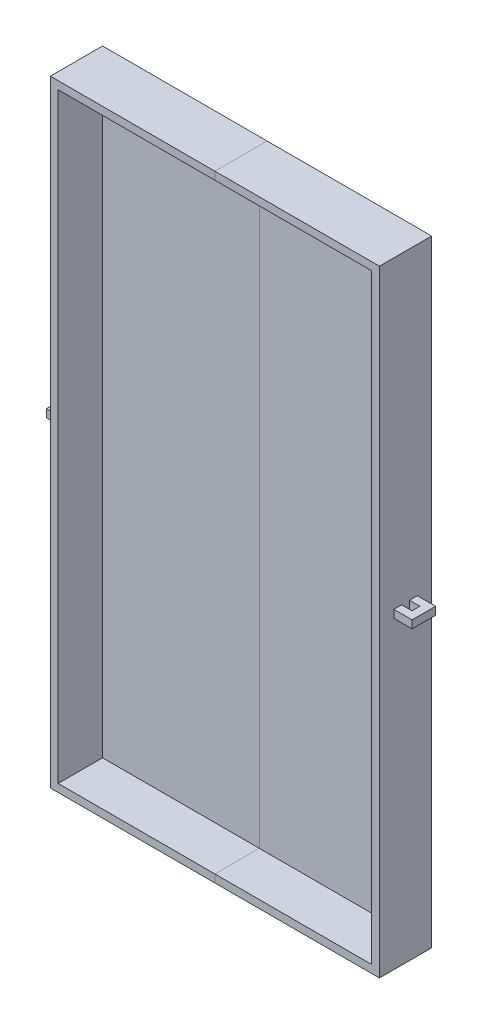
ISO-10303-21;
HEADER;
FILE_DESCRIPTION(('STEP AP214'),'2;1');
FILE_NAME('part.step','',(''),(''),'','','');
FILE_SCHEMA(('AUTOMOTIVE_DESIGN { 1 0 10303 214 1 1 1 1 }'));
ENDSEC;
DATA;
#1=APPLICATION_CONTEXT('core data for automotive mechanical design processes');
#2=APPLICATION_PROTOCOL_DEFINITION('international standard','automotive_design',2000,#1);
#3=PRODUCT_CONTEXT('',#1,'mechanical');
#4=PRODUCT('Part','Part','',(#3));
#5=PRODUCT_RELATED_PRODUCT_CATEGORY('part','',(#4));
#6=PRODUCT_DEFINITION_FORMATION('','',#4);
#7=PRODUCT_DEFINITION_CONTEXT('part definition',#1,'design');
#8=PRODUCT_DEFINITION('design','',#6,#7);
#9=PRODUCT_DEFINITION_SHAPE('','',#8);
#10=(LENGTH_UNIT() NAMED_UNIT(*) SI_UNIT(.MILLI.,.METRE.));
#11=(NAMED_UNIT(*) PLANE_ANGLE_UNIT() SI_UNIT($,.RADIAN.));
#12=(NAMED_UNIT(*) SI_UNIT($,.STERADIAN.) SOLID_ANGLE_UNIT());
#13=UNCERTAINTY_MEASURE_WITH_UNIT(LENGTH_MEASURE(1.E-05),#10,'distance_accuracy_value','');
#14=(GEOMETRIC_REPRESENTATION_CONTEXT(3) GLOBAL_UNCERTAINTY_ASSIGNED_CONTEXT((#13)) GLOBAL_UNIT_ASSIGNED_CONTEXT((#10,
#11,#12)) REPRESENTATION_CONTEXT('',''));
#15=CARTESIAN_POINT('',(0.,0.,0.));
#16=DIRECTION('',(0.,0.,1.));
#17=DIRECTION('',(1.,0.,0.));
#18=AXIS2_PLACEMENT_3D('',#15,#16,#17);
#19=CARTESIAN_POINT('',(63.,59.75,4.25));
#20=DIRECTION('',(0.,1.,0.));
#21=DIRECTION('',(0.,0.,1.));
#22=AXIS2_PLACEMENT_3D('',#19,#20,#21);
#23=PLANE('',#22);
#24=DIRECTION('',(0.,0.,-1.));
#25=VECTOR('',#24,1.);
#26=CARTESIAN_POINT('',(65.,59.75,3.5));
#27=LINE('',#26,#25);
#28=CARTESIAN_POINT('',(65.,59.75,2.75));
#29=VERTEX_POINT('',#28);
#30=CARTESIAN_POINT('',(65.,59.75,4.25));
#31=VERTEX_POINT('',#30);
#32=EDGE_CURVE('P0_E125',#29,#31,#27,.F.);
#33=ORIENTED_EDGE('',*,*,#32,.T.);
#34=DIRECTION('',(-1.,0.,0.));
#35=VECTOR('',#34,1.);
#36=CARTESIAN_POINT('',(63.,59.75,4.25));
#37=LINE('',#36,#35);
#38=CARTESIAN_POINT('',(63.,59.75,4.25));
#39=VERTEX_POINT('',#38);
#40=EDGE_CURVE('P0_E160',#39,#31,#37,.F.);
#41=ORIENTED_EDGE('',*,*,#40,.F.);
#42=DIRECTION('',(0.,0.,1.));
#43=VECTOR('',#42,1.);
#44=CARTESIAN_POINT('',(63.,59.75,4.25));
#45=LINE('',#44,#43);
#46=CARTESIAN_POINT('',(63.,59.75,5.75));
#47=VERTEX_POINT('',#46);
#48=EDGE_CURVE('P0_E19',#39,#47,#45,.T.);
#49=ORIENTED_EDGE('',*,*,#48,.T.);
#50=DIRECTION('',(1.,0.,0.));
#51=VECTOR('',#50,1.);
#52=CARTESIAN_POINT('',(63.,59.75,5.75));
#53=LINE('',#52,#51);
#54=CARTESIAN_POINT('',(66.5,59.75,5.75));
#55=VERTEX_POINT('',#54);
#56=EDGE_CURVE('P0_E191',#55,#47,#53,.F.);
#57=ORIENTED_EDGE('',*,*,#56,.F.);
#58=DIRECTION('',(0.,0.,-1.));
#59=VECTOR('',#58,1.);
#60=CARTESIAN_POINT('',(66.5,59.75,3.5));
#61=LINE('',#60,#59);
#62=CARTESIAN_POINT('',(66.5,59.75,1.25));
#63=VERTEX_POINT('',#62);
#64=EDGE_CURVE('P0_E199',#63,#55,#61,.F.);
#65=ORIENTED_EDGE('',*,*,#64,.F.);
#66=DIRECTION('',(-1.,0.,0.));
#67=VECTOR('',#66,1.);
#68=CARTESIAN_POINT('',(63.,59.75,1.25));
#69=LINE('',#68,#67);
#70=CARTESIAN_POINT('',(63.,59.75,1.25));
#71=VERTEX_POINT('',#70);
#72=EDGE_CURVE('P0_E148',#71,#63,#69,.F.);
#73=ORIENTED_EDGE('',*,*,#72,.F.);
#74=DIRECTION('',(0.,0.,1.));
#75=VECTOR('',#74,1.);
#76=CARTESIAN_POINT('',(63.,59.75,4.25));
#77=LINE('',#76,#75);
#78=CARTESIAN_POINT('',(63.,59.75,2.75));
#79=VERTEX_POINT('',#78);
#80=EDGE_CURVE('P0_E134',#71,#79,#77,.T.);
#81=ORIENTED_EDGE('',*,*,#80,.T.);
#82=DIRECTION('',(1.,0.,0.));
#83=VECTOR('',#82,1.);
#84=CARTESIAN_POINT('',(63.,59.75,2.75));
#85=LINE('',#84,#83);
#86=EDGE_CURVE('P0_E145',#29,#79,#85,.F.);
#87=ORIENTED_EDGE('',*,*,#86,.F.);
#88=EDGE_LOOP('',(#33,#41,#49,#57,#65,#73,#81,#87));
#89=FACE_BOUND('',#88,.T.);
#90=ADVANCED_FACE('P0_F16',(#89),#23,.T.);
#91=CARTESIAN_POINT('',(65.,59.,3.5));
#92=DIRECTION('',(1.,0.,0.));
#93=DIRECTION('',(0.,0.,-1.));
#94=AXIS2_PLACEMENT_3D('',#91,#92,#93);
#95=PLANE('',#94);
#96=ORIENTED_EDGE('',*,*,#32,.F.);
#97=DIRECTION('',(0.,1.,0.));
#98=VECTOR('',#97,1.);
#99=CARTESIAN_POINT('',(65.,59.75,2.75));
#100=LINE('',#99,#98);
#101=CARTESIAN_POINT('',(65.,58.25,2.75));
#102=VERTEX_POINT('',#101);
#103=EDGE_CURVE('P0_E142',#102,#29,#100,.T.);
#104=ORIENTED_EDGE('',*,*,#103,.F.);
#105=DIRECTION('',(0.,0.,-1.));
#106=VECTOR('',#105,1.);
#107=CARTESIAN_POINT('',(65.,58.25,5.75));
#108=LINE('',#107,#106);
#109=CARTESIAN_POINT('',(65.,58.25,4.25));
#110=VERTEX_POINT('',#109);
#111=EDGE_CURVE('P0_E166',#110,#102,#108,.T.);
#112=ORIENTED_EDGE('',*,*,#111,.F.);
#113=DIRECTION('',(0.,1.,0.));
#114=VECTOR('',#113,1.);
#115=CARTESIAN_POINT('',(65.,58.25,4.25));
#116=LINE('',#115,#114);
#117=EDGE_CURVE('P0_E163',#31,#110,#116,.F.);
#118=ORIENTED_EDGE('',*,*,#117,.F.);
#119=EDGE_LOOP('',(#96,#104,#112,#118));
#120=FACE_BOUND('',#119,.T.);
#121=ADVANCED_FACE('P0_F164',(#120),#95,.F.);
#122=CARTESIAN_POINT('',(63.,59.75,2.75));
#123=DIRECTION('',(0.,0.,1.));
#124=DIRECTION('',(1.,0.,0.));
#125=AXIS2_PLACEMENT_3D('',#122,#123,#124);
#126=PLANE('',#125);
#127=ORIENTED_EDGE('',*,*,#103,.T.);
#128=ORIENTED_EDGE('',*,*,#86,.T.);
#129=DIRECTION('',(0.,1.,0.));
#130=VECTOR('',#129,1.);
#131=CARTESIAN_POINT('',(63.,59.75,2.75));
#132=LINE('',#131,#130);
#133=CARTESIAN_POINT('',(63.,58.25,2.75));
#134=VERTEX_POINT('',#133);
#135=EDGE_CURVE('P0_E130',#79,#134,#132,.F.);
#136=ORIENTED_EDGE('',*,*,#135,.T.);
#137=DIRECTION('',(1.,0.,0.));
#138=VECTOR('',#137,1.);
#139=CARTESIAN_POINT('',(63.,58.25,2.75));
#140=LINE('',#139,#138);
#141=EDGE_CURVE('P0_E220',#102,#134,#140,.F.);
#142=ORIENTED_EDGE('',*,*,#141,.F.);
#143=EDGE_LOOP('',(#127,#128,#136,#142));
#144=FACE_BOUND('',#143,.T.);
#145=ADVANCED_FACE('P0_F150',(#144),#126,.T.);
#146=CARTESIAN_POINT('',(63.,58.25,1.25));
#147=DIRECTION('',(0.,0.,-1.));
#148=DIRECTION('',(-1.,0.,0.));
#149=AXIS2_PLACEMENT_3D('',#146,#147,#148);
#150=PLANE('',#149);
#151=DIRECTION('',(0.,1.,0.));
#152=VECTOR('',#151,1.);
#153=CARTESIAN_POINT('',(66.5,59.,1.25));
#154=LINE('',#153,#152);
#155=CARTESIAN_POINT('',(66.5,58.25,1.25));
#156=VERTEX_POINT('',#155);
#157=EDGE_CURVE('P0_E201',#156,#63,#154,.T.);
#158=ORIENTED_EDGE('',*,*,#157,.F.);
#159=DIRECTION('',(1.,0.,0.));
#160=VECTOR('',#159,1.);
#161=CARTESIAN_POINT('',(63.,58.25,1.25));
#162=LINE('',#161,#160);
#163=CARTESIAN_POINT('',(63.,58.25,1.25));
#164=VERTEX_POINT('',#163);
#165=EDGE_CURVE('P0_E217',#164,#156,#162,.T.);
#166=ORIENTED_EDGE('',*,*,#165,.F.);
#167=DIRECTION('',(0.,1.,0.));
#168=VECTOR('',#167,1.);
#169=CARTESIAN_POINT('',(63.,58.25,1.25));
#170=LINE('',#169,#168);
#171=EDGE_CURVE('P0_E151',#164,#71,#170,.T.);
#172=ORIENTED_EDGE('',*,*,#171,.T.);
#173=ORIENTED_EDGE('',*,*,#72,.T.);
#174=EDGE_LOOP('',(#158,#166,#172,#173));
#175=FACE_BOUND('',#174,.T.);
#176=ADVANCED_FACE('P0_F204',(#175),#150,.T.);
#177=CARTESIAN_POINT('',(66.5,59.,3.5));
#178=DIRECTION('',(1.,0.,0.));
#179=DIRECTION('',(0.,0.,-1.));
#180=AXIS2_PLACEMENT_3D('',#177,#178,#179);
#181=PLANE('',#180);
#182=ORIENTED_EDGE('',*,*,#64,.T.);
#183=DIRECTION('',(0.,1.,0.));
#184=VECTOR('',#183,1.);
#185=CARTESIAN_POINT('',(66.5,59.75,5.75));
#186=LINE('',#185,#184);
#187=CARTESIAN_POINT('',(66.5,58.25,5.75));
#188=VERTEX_POINT('',#187);
#189=EDGE_CURVE('P0_E194',#188,#55,#186,.T.);
#190=ORIENTED_EDGE('',*,*,#189,.F.);
#191=DIRECTION('',(0.,0.,-1.));
#192=VECTOR('',#191,1.);
#193=CARTESIAN_POINT('',(66.5,58.25,5.75));
#194=LINE('',#193,#192);
#195=EDGE_CURVE('P0_E211',#156,#188,#194,.F.);
#196=ORIENTED_EDGE('',*,*,#195,.F.);
#197=ORIENTED_EDGE('',*,*,#157,.T.);
#198=EDGE_LOOP('',(#182,#190,#196,#197));
#199=FACE_BOUND('',#198,.T.);
#200=ADVANCED_FACE('P0_F209',(#199),#181,.T.);
#201=CARTESIAN_POINT('',(63.,59.75,5.75));
#202=DIRECTION('',(0.,0.,1.));
#203=DIRECTION('',(1.,0.,0.));
#204=AXIS2_PLACEMENT_3D('',#201,#202,#203);
#205=PLANE('',#204);
#206=ORIENTED_EDGE('',*,*,#189,.T.);
#207=ORIENTED_EDGE('',*,*,#56,.T.);
#208=DIRECTION('',(0.,1.,0.));
#209=VECTOR('',#208,1.);
#210=CARTESIAN_POINT('',(63.,59.75,5.75));
#211=LINE('',#210,#209);
#212=CARTESIAN_POINT('',(63.,58.25,5.75));
#213=VERTEX_POINT('',#212);
#214=EDGE_CURVE('P0_E197',#47,#213,#211,.F.);
#215=ORIENTED_EDGE('',*,*,#214,.T.);
#216=DIRECTION('',(1.,0.,0.));
#217=VECTOR('',#216,1.);
#218=CARTESIAN_POINT('',(63.,58.25,5.75));
#219=LINE('',#218,#217);
#220=EDGE_CURVE('P0_E216',#188,#213,#219,.F.);
#221=ORIENTED_EDGE('',*,*,#220,.F.);
#222=EDGE_LOOP('',(#206,#207,#215,#221));
#223=FACE_BOUND('',#222,.T.);
#224=ADVANCED_FACE('P0_F400',(#223),#205,.T.);
#225=CARTESIAN_POINT('',(61.5,115.5,0.));
#226=DIRECTION('',(1.,0.,0.));
#227=DIRECTION('',(0.,0.,-1.));
#228=AXIS2_PLACEMENT_3D('',#225,#226,#227);
#229=PLANE('',#228);
#230=DIRECTION('',(0.,0.,1.));
#231=VECTOR('',#230,1.);
#232=CARTESIAN_POINT('',(61.5,116.5,0.));
#233=LINE('',#232,#231);
#234=CARTESIAN_POINT('',(61.5,116.5,8.5));
#235=VERTEX_POINT('',#234);
#236=CARTESIAN_POINT('',(61.5,116.5,0.));
#237=VERTEX_POINT('',#236);
#238=EDGE_CURVE('P0_E189',#235,#237,#233,.F.);
#239=ORIENTED_EDGE('',*,*,#238,.T.);
#240=DIRECTION('',(0.,1.,0.));
#241=VECTOR('',#240,1.);
#242=CARTESIAN_POINT('',(61.5,59.,0.));
#243=LINE('',#242,#241);
#244=CARTESIAN_POINT('',(61.5,1.5,0.));
#245=VERTEX_POINT('',#244);
#246=EDGE_CURVE('P0_E186',#245,#237,#243,.T.);
#247=ORIENTED_EDGE('',*,*,#246,.F.);
#248=DIRECTION('',(0.,0.,1.));
#249=VECTOR('',#248,1.);
#250=CARTESIAN_POINT('',(61.5,1.5,0.));
#251=LINE('',#250,#249);
#252=CARTESIAN_POINT('',(61.5,1.5,8.5));
#253=VERTEX_POINT('',#252);
#254=EDGE_CURVE('P0_E177',#253,#245,#251,.F.);
#255=ORIENTED_EDGE('',*,*,#254,.F.);
#256=DIRECTION('',(0.,1.,0.));
#257=VECTOR('',#256,1.);
#258=CARTESIAN_POINT('',(61.5,59.,8.5));
#259=LINE('',#258,#257);
#260=EDGE_CURVE('P0_E259',#253,#235,#259,.T.);
#261=ORIENTED_EDGE('',*,*,#260,.T.);
#262=EDGE_LOOP('',(#239,#247,#255,#261));
#263=FACE_BOUND('',#262,.T.);
#264=ADVANCED_FACE('P0_F274',(#263),#229,.F.);
#265=CARTESIAN_POINT('',(2.5,116.5,0.));
#266=DIRECTION('',(0.,1.,0.));
#267=DIRECTION('',(0.,0.,1.));
#268=AXIS2_PLACEMENT_3D('',#265,#266,#267);
#269=PLANE('',#268);
#270=DIRECTION('',(1.,0.,0.));
#271=VECTOR('',#270,1.);
#272=CARTESIAN_POINT('',(31.5,116.5,0.));
#273=LINE('',#272,#271);
#274=CARTESIAN_POINT('',(31.5,116.5,0.));
#275=VERTEX_POINT('',#274);
#276=EDGE_CURVE('P0_E183',#237,#275,#273,.F.);
#277=ORIENTED_EDGE('',*,*,#276,.F.);
#278=ORIENTED_EDGE('',*,*,#238,.F.);
#279=DIRECTION('',(-1.,0.,0.));
#280=VECTOR('',#279,1.);
#281=CARTESIAN_POINT('',(31.5,116.5,8.5));
#282=LINE('',#281,#280);
#283=CARTESIAN_POINT('',(31.5,116.5,8.5));
#284=VERTEX_POINT('',#283);
#285=EDGE_CURVE('P0_E257',#235,#284,#282,.T.);
#286=ORIENTED_EDGE('',*,*,#285,.T.);
#287=DIRECTION('',(0.,0.,-1.));
#288=VECTOR('',#287,1.);
#289=CARTESIAN_POINT('',(31.5,116.5,0.));
#290=LINE('',#289,#288);
#291=EDGE_CURVE('P0_E250',#284,#275,#290,.T.);
#292=ORIENTED_EDGE('',*,*,#291,.T.);
#293=EDGE_LOOP('',(#277,#278,#286,#292));
#294=FACE_BOUND('',#293,.T.);
#295=ADVANCED_FACE('P0_F277',(#294),#269,.F.);
#296=CARTESIAN_POINT('',(31.5,59.,0.));
#297=DIRECTION('',(0.,0.,1.));
#298=DIRECTION('',(1.,0.,0.));
#299=AXIS2_PLACEMENT_3D('',#296,#297,#298);
#300=PLANE('',#299);
#301=ORIENTED_EDGE('',*,*,#246,.T.);
#302=ORIENTED_EDGE('',*,*,#276,.T.);
#303=DIRECTION('',(0.,1.,0.));
#304=VECTOR('',#303,1.);
#305=CARTESIAN_POINT('',(31.5,0.,0.));
#306=LINE('',#305,#304);
#307=CARTESIAN_POINT('',(31.5,1.5,0.));
#308=VERTEX_POINT('',#307);
#309=EDGE_CURVE('P0_E248',#275,#308,#306,.F.);
#310=ORIENTED_EDGE('',*,*,#309,.T.);
#311=DIRECTION('',(1.,0.,0.));
#312=VECTOR('',#311,1.);
#313=CARTESIAN_POINT('',(60.5,1.5,0.));
#314=LINE('',#313,#312);
#315=EDGE_CURVE('P0_E174',#245,#308,#314,.F.);
#316=ORIENTED_EDGE('',*,*,#315,.F.);
#317=EDGE_LOOP('',(#301,#302,#310,#316));
#318=FACE_BOUND('',#317,.T.);
#319=ADVANCED_FACE('P0_F282',(#318),#300,.T.);
#320=CARTESIAN_POINT('',(60.5,1.5,0.));
#321=DIRECTION('',(0.,1.,0.));
#322=DIRECTION('',(0.,0.,1.));
#323=AXIS2_PLACEMENT_3D('',#320,#321,#322);
#324=PLANE('',#323);
#325=ORIENTED_EDGE('',*,*,#254,.T.);
#326=ORIENTED_EDGE('',*,*,#315,.T.);
#327=DIRECTION('',(0.,0.,-1.));
#328=VECTOR('',#327,1.);
#329=CARTESIAN_POINT('',(31.5,1.5,0.));
#330=LINE('',#329,#328);
#331=CARTESIAN_POINT('',(31.5,1.5,8.5));
#332=VERTEX_POINT('',#331);
#333=EDGE_CURVE('P0_E245',#308,#332,#330,.F.);
#334=ORIENTED_EDGE('',*,*,#333,.T.);
#335=DIRECTION('',(-1.,0.,0.));
#336=VECTOR('',#335,1.);
#337=CARTESIAN_POINT('',(31.5,1.5,8.5));
#338=LINE('',#337,#336);
#339=EDGE_CURVE('P0_E261',#332,#253,#338,.F.);
#340=ORIENTED_EDGE('',*,*,#339,.T.);
#341=EDGE_LOOP('',(#325,#326,#334,#340));
#342=FACE_BOUND('',#341,.T.);
#343=ADVANCED_FACE('P0_F265',(#342),#324,.T.);
#344=CARTESIAN_POINT('',(63.,58.25,4.25));
#345=DIRECTION('',(0.,0.,-1.));
#346=DIRECTION('',(-1.,0.,0.));
#347=AXIS2_PLACEMENT_3D('',#344,#345,#346);
#348=PLANE('',#347);
#349=ORIENTED_EDGE('',*,*,#117,.T.);
#350=DIRECTION('',(1.,0.,0.));
#351=VECTOR('',#350,1.);
#352=CARTESIAN_POINT('',(63.,58.25,4.25));
#353=LINE('',#352,#351);
#354=CARTESIAN_POINT('',(63.,58.25,4.25));
#355=VERTEX_POINT('',#354);
#356=EDGE_CURVE('P0_E169',#355,#110,#353,.T.);
#357=ORIENTED_EDGE('',*,*,#356,.F.);
#358=DIRECTION('',(0.,1.,0.));
#359=VECTOR('',#358,1.);
#360=CARTESIAN_POINT('',(63.,118.,4.25));
#361=LINE('',#360,#359);
#362=EDGE_CURVE('P0_E173',#39,#355,#361,.F.);
#363=ORIENTED_EDGE('',*,*,#362,.F.);
#364=ORIENTED_EDGE('',*,*,#40,.T.);
#365=EDGE_LOOP('',(#349,#357,#363,#364));
#366=FACE_BOUND('',#365,.T.);
#367=ADVANCED_FACE('P0_F171',(#366),#348,.T.);
#368=CARTESIAN_POINT('',(63.,58.25,5.75));
#369=DIRECTION('',(0.,-1.,0.));
#370=DIRECTION('',(0.,0.,-1.));
#371=AXIS2_PLACEMENT_3D('',#368,#369,#370);
#372=PLANE('',#371);
#373=ORIENTED_EDGE('',*,*,#195,.T.);
#374=ORIENTED_EDGE('',*,*,#220,.T.);
#375=DIRECTION('',(0.,0.,-1.));
#376=VECTOR('',#375,1.);
#377=CARTESIAN_POINT('',(63.,58.25,0.));
#378=LINE('',#377,#376);
#379=EDGE_CURVE('P0_E227',#355,#213,#378,.F.);
#380=ORIENTED_EDGE('',*,*,#379,.F.);
#381=ORIENTED_EDGE('',*,*,#356,.T.);
#382=ORIENTED_EDGE('',*,*,#111,.T.);
#383=ORIENTED_EDGE('',*,*,#141,.T.);
#384=DIRECTION('',(0.,0.,-1.));
#385=VECTOR('',#384,1.);
#386=CARTESIAN_POINT('',(63.,58.25,0.));
#387=LINE('',#386,#385);
#388=EDGE_CURVE('P0_E137',#164,#134,#387,.F.);
#389=ORIENTED_EDGE('',*,*,#388,.F.);
#390=ORIENTED_EDGE('',*,*,#165,.T.);
#391=EDGE_LOOP('',(#373,#374,#380,#381,#382,#383,#389,#390));
#392=FACE_BOUND('',#391,.T.);
#393=ADVANCED_FACE('P0_F219',(#392),#372,.T.);
#394=CARTESIAN_POINT('',(31.5,59.,8.5));
#395=DIRECTION('',(0.,0.,-1.));
#396=DIRECTION('',(-1.,0.,0.));
#397=AXIS2_PLACEMENT_3D('',#394,#395,#396);
#398=PLANE('',#397);
#399=DIRECTION('',(1.,0.,0.));
#400=VECTOR('',#399,1.);
#401=CARTESIAN_POINT('',(63.,0.,8.5));
#402=LINE('',#401,#400);
#403=CARTESIAN_POINT('',(63.,0.,8.5));
#404=VERTEX_POINT('',#403);
#405=CARTESIAN_POINT('',(31.5,0.,8.5));
#406=VERTEX_POINT('',#405);
#407=EDGE_CURVE('P0_E288',#404,#406,#402,.F.);
#408=ORIENTED_EDGE('',*,*,#407,.F.);
#409=DIRECTION('',(0.,1.,0.));
#410=VECTOR('',#409,1.);
#411=CARTESIAN_POINT('',(63.,118.,8.5));
#412=LINE('',#411,#410);
#413=CARTESIAN_POINT('',(63.,118.,8.5));
#414=VERTEX_POINT('',#413);
#415=EDGE_CURVE('P0_E237',#414,#404,#412,.F.);
#416=ORIENTED_EDGE('',*,*,#415,.F.);
#417=DIRECTION('',(1.,0.,0.));
#418=VECTOR('',#417,1.);
#419=CARTESIAN_POINT('',(0.,118.,8.5));
#420=LINE('',#419,#418);
#421=CARTESIAN_POINT('',(31.5,118.,8.5));
#422=VERTEX_POINT('',#421);
#423=EDGE_CURVE('P0_E239',#422,#414,#420,.T.);
#424=ORIENTED_EDGE('',*,*,#423,.F.);
#425=DIRECTION('',(0.,1.,0.));
#426=VECTOR('',#425,1.);
#427=CARTESIAN_POINT('',(31.5,0.,8.5));
#428=LINE('',#427,#426);
#429=EDGE_CURVE('P0_E252',#422,#284,#428,.F.);
#430=ORIENTED_EDGE('',*,*,#429,.T.);
#431=ORIENTED_EDGE('',*,*,#285,.F.);
#432=ORIENTED_EDGE('',*,*,#260,.F.);
#433=ORIENTED_EDGE('',*,*,#339,.F.);
#434=DIRECTION('',(0.,1.,0.));
#435=VECTOR('',#434,1.);
#436=CARTESIAN_POINT('',(31.5,0.,8.5));
#437=LINE('',#436,#435);
#438=EDGE_CURVE('P0_E255',#332,#406,#437,.F.);
#439=ORIENTED_EDGE('',*,*,#438,.T.);
#440=EDGE_LOOP('',(#408,#416,#424,#430,#431,#432,#433,#439));
#441=FACE_BOUND('',#440,.T.);
#442=ADVANCED_FACE('P0_F271',(#441),#398,.F.);
#443=CARTESIAN_POINT('',(31.5,0.,0.));
#444=DIRECTION('',(1.,0.,0.));
#445=DIRECTION('',(0.,0.,-1.));
#446=AXIS2_PLACEMENT_3D('',#443,#444,#445);
#447=PLANE('',#446);
#448=ORIENTED_EDGE('',*,*,#309,.F.);
#449=ORIENTED_EDGE('',*,*,#291,.F.);
#450=ORIENTED_EDGE('',*,*,#429,.F.);
#451=DIRECTION('',(0.,0.,1.));
#452=VECTOR('',#451,1.);
#453=CARTESIAN_POINT('',(31.5,118.,0.));
#454=LINE('',#453,#452);
#455=CARTESIAN_POINT('',(31.5,118.,-1.5));
#456=VERTEX_POINT('',#455);
#457=EDGE_CURVE('P0_E242',#456,#422,#454,.T.);
#458=ORIENTED_EDGE('',*,*,#457,.F.);
#459=DIRECTION('',(0.,1.,0.));
#460=VECTOR('',#459,1.);
#461=CARTESIAN_POINT('',(31.5,59.,-1.5));
#462=LINE('',#461,#460);
#463=CARTESIAN_POINT('',(31.5,0.,-1.5));
#464=VERTEX_POINT('',#463);
#465=EDGE_CURVE('P0_E291',#464,#456,#462,.T.);
#466=ORIENTED_EDGE('',*,*,#465,.F.);
#467=DIRECTION('',(0.,0.,-1.));
#468=VECTOR('',#467,1.);
#469=CARTESIAN_POINT('',(31.5,0.,0.));
#470=LINE('',#469,#468);
#471=EDGE_CURVE('P0_E231',#406,#464,#470,.T.);
#472=ORIENTED_EDGE('',*,*,#471,.F.);
#473=ORIENTED_EDGE('',*,*,#438,.F.);
#474=ORIENTED_EDGE('',*,*,#333,.F.);
#475=EDGE_LOOP('',(#448,#449,#450,#458,#466,#472,#473,#474));
#476=FACE_BOUND('',#475,.T.);
#477=ADVANCED_FACE('P0_F284',(#476),#447,.F.);
#478=CARTESIAN_POINT('',(0.,118.,0.));
#479=DIRECTION('',(0.,1.,0.));
#480=DIRECTION('',(0.,0.,1.));
#481=AXIS2_PLACEMENT_3D('',#478,#479,#480);
#482=PLANE('',#481);
#483=DIRECTION('',(0.,0.,-1.));
#484=VECTOR('',#483,1.);
#485=CARTESIAN_POINT('',(63.,118.,0.));
#486=LINE('',#485,#484);
#487=CARTESIAN_POINT('',(63.,118.,-1.5));
#488=VERTEX_POINT('',#487);
#489=EDGE_CURVE('P0_E228',#488,#414,#486,.F.);
#490=ORIENTED_EDGE('',*,*,#489,.F.);
#491=DIRECTION('',(-1.,0.,0.));
#492=VECTOR('',#491,1.);
#493=CARTESIAN_POINT('',(31.5,118.,-1.5));
#494=LINE('',#493,#492);
#495=EDGE_CURVE('P0_E299',#456,#488,#494,.F.);
#496=ORIENTED_EDGE('',*,*,#495,.F.);
#497=ORIENTED_EDGE('',*,*,#457,.T.);
#498=ORIENTED_EDGE('',*,*,#423,.T.);
#499=EDGE_LOOP('',(#490,#496,#497,#498));
#500=FACE_BOUND('',#499,.T.);
#501=ADVANCED_FACE('P0_F306',(#500),#482,.T.);
#502=CARTESIAN_POINT('',(63.,118.,0.));
#503=DIRECTION('',(1.,0.,0.));
#504=DIRECTION('',(0.,0.,-1.));
#505=AXIS2_PLACEMENT_3D('',#502,#503,#504);
#506=PLANE('',#505);
#507=ORIENTED_EDGE('',*,*,#171,.F.);
#508=ORIENTED_EDGE('',*,*,#388,.T.);
#509=ORIENTED_EDGE('',*,*,#135,.F.);
#510=ORIENTED_EDGE('',*,*,#80,.F.);
#511=EDGE_LOOP('',(#507,#508,#509,#510));
#512=FACE_BOUND('',#511,.T.);
#513=ORIENTED_EDGE('',*,*,#48,.F.);
#514=ORIENTED_EDGE('',*,*,#362,.T.);
#515=ORIENTED_EDGE('',*,*,#379,.T.);
#516=ORIENTED_EDGE('',*,*,#214,.F.);
#517=EDGE_LOOP('',(#513,#514,#515,#516));
#518=FACE_BOUND('',#517,.T.);
#519=DIRECTION('',(0.,1.,0.));
#520=VECTOR('',#519,1.);
#521=CARTESIAN_POINT('',(63.,59.,-1.5));
#522=LINE('',#521,#520);
#523=CARTESIAN_POINT('',(63.,0.,-1.5));
#524=VERTEX_POINT('',#523);
#525=EDGE_CURVE('P0_E25',#488,#524,#522,.F.);
#526=ORIENTED_EDGE('',*,*,#525,.F.);
#527=ORIENTED_EDGE('',*,*,#489,.T.);
#528=ORIENTED_EDGE('',*,*,#415,.T.);
#529=DIRECTION('',(0.,0.,-1.));
#530=VECTOR('',#529,1.);
#531=CARTESIAN_POINT('',(63.,0.,0.));
#532=LINE('',#531,#530);
#533=EDGE_CURVE('P0_E34',#524,#404,#532,.F.);
#534=ORIENTED_EDGE('',*,*,#533,.F.);
#535=EDGE_LOOP('',(#526,#527,#528,#534));
#536=FACE_BOUND('',#535,.T.);
#537=ADVANCED_FACE('P0_F132',(#512,#518,#536),#506,.T.);
#538=CARTESIAN_POINT('',(63.,0.,0.));
#539=DIRECTION('',(0.,-1.,0.));
#540=DIRECTION('',(0.,0.,-1.));
#541=AXIS2_PLACEMENT_3D('',#538,#539,#540);
#542=PLANE('',#541);
#543=ORIENTED_EDGE('',*,*,#533,.T.);
#544=ORIENTED_EDGE('',*,*,#407,.T.);
#545=ORIENTED_EDGE('',*,*,#471,.T.);
#546=DIRECTION('',(-1.,0.,0.));
#547=VECTOR('',#546,1.);
#548=CARTESIAN_POINT('',(31.5,0.,-1.5));
#549=LINE('',#548,#547);
#550=EDGE_CURVE('P0_E10',#524,#464,#549,.T.);
#551=ORIENTED_EDGE('',*,*,#550,.F.);
#552=EDGE_LOOP('',(#543,#544,#545,#551));
#553=FACE_BOUND('',#552,.T.);
#554=ADVANCED_FACE('P0_F293',(#553),#542,.T.);
#555=CARTESIAN_POINT('',(31.5,59.,-1.5));
#556=DIRECTION('',(0.,0.,-1.));
#557=DIRECTION('',(-1.,0.,0.));
#558=AXIS2_PLACEMENT_3D('',#555,#556,#557);
#559=PLANE('',#558);
#560=ORIENTED_EDGE('',*,*,#525,.T.);
#561=ORIENTED_EDGE('',*,*,#550,.T.);
#562=ORIENTED_EDGE('',*,*,#465,.T.);
#563=ORIENTED_EDGE('',*,*,#495,.T.);
#564=EDGE_LOOP('',(#560,#561,#562,#563));
#565=FACE_BOUND('',#564,.T.);
#566=ADVANCED_FACE('P0_F303',(#565),#559,.T.);
#567=CLOSED_SHELL('',(#90,#121,#145,#176,#200,#224,#264,#295,#319,#343,#367,#393,#442,#477,#501,
#537,#554,#566));
#568=MANIFOLD_SOLID_BREP('P0_B1',#567);
#569=CARTESIAN_POINT('',(0.,58.25,4.25));
#570=DIRECTION('',(0.,0.,1.));
#571=DIRECTION('',(1.,0.,0.));
#572=AXIS2_PLACEMENT_3D('',#569,#570,#571);
#573=PLANE('',#572);
#574=DIRECTION('',(1.,0.,0.));
#575=VECTOR('',#574,1.);
#576=CARTESIAN_POINT('',(0.,58.25,4.25));
#577=LINE('',#576,#575);
#578=CARTESIAN_POINT('',(0.,58.25,4.25));
#579=VERTEX_POINT('',#578);
#580=CARTESIAN_POINT('',(-2.,58.25,4.25));
#581=VERTEX_POINT('',#580);
#582=EDGE_CURVE('P1_E175',#579,#581,#577,.F.);
#583=ORIENTED_EDGE('',*,*,#582,.T.);
#584=DIRECTION('',(0.,1.,0.));
#585=VECTOR('',#584,1.);
#586=CARTESIAN_POINT('',(-2.,59.,4.25));
#587=LINE('',#586,#585);
#588=CARTESIAN_POINT('',(-2.,59.75,4.25));
#589=VERTEX_POINT('',#588);
#590=EDGE_CURVE('P1_E153',#589,#581,#587,.F.);
#591=ORIENTED_EDGE('',*,*,#590,.F.);
#592=DIRECTION('',(1.,0.,0.));
#593=VECTOR('',#592,1.);
#594=CARTESIAN_POINT('',(0.,59.75,4.25));
#595=LINE('',#594,#593);
#596=CARTESIAN_POINT('',(0.,59.75,4.25));
#597=VERTEX_POINT('',#596);
#598=EDGE_CURVE('P1_E173',#589,#597,#595,.T.);
#599=ORIENTED_EDGE('',*,*,#598,.T.);
#600=DIRECTION('',(0.,1.,0.));
#601=VECTOR('',#600,1.);
#602=CARTESIAN_POINT('',(0.,58.25,4.25));
#603=LINE('',#602,#601);
#604=EDGE_CURVE('P1_E20',#579,#597,#603,.T.);
#605=ORIENTED_EDGE('',*,*,#604,.F.);
#606=EDGE_LOOP('',(#583,#591,#599,#605));
#607=FACE_BOUND('',#606,.T.);
#608=ADVANCED_FACE('P1_F17',(#607),#573,.F.);
#609=CARTESIAN_POINT('',(0.,58.25,1.25));
#610=DIRECTION('',(0.,0.,1.));
#611=DIRECTION('',(1.,0.,0.));
#612=AXIS2_PLACEMENT_3D('',#609,#610,#611);
#613=PLANE('',#612);
#614=DIRECTION('',(1.,0.,0.));
#615=VECTOR('',#614,1.);
#616=CARTESIAN_POINT('',(0.,58.25,1.25));
#617=LINE('',#616,#615);
#618=CARTESIAN_POINT('',(0.,58.25,1.25));
#619=VERTEX_POINT('',#618);
#620=CARTESIAN_POINT('',(-3.50000000000001,58.25,1.25));
#621=VERTEX_POINT('',#620);
#622=EDGE_CURVE('P1_E187',#619,#621,#617,.F.);
#623=ORIENTED_EDGE('',*,*,#622,.T.);
#624=DIRECTION('',(0.,1.,0.));
#625=VECTOR('',#624,1.);
#626=CARTESIAN_POINT('',(-3.50000000000001,59.,1.25));
#627=LINE('',#626,#625);
#628=CARTESIAN_POINT('',(-3.50000000000001,59.75,1.25));
#629=VERTEX_POINT('',#628);
#630=EDGE_CURVE('P1_E139',#621,#629,#627,.T.);
#631=ORIENTED_EDGE('',*,*,#630,.T.);
#632=DIRECTION('',(1.,0.,0.));
#633=VECTOR('',#632,1.);
#634=CARTESIAN_POINT('',(0.,59.75,1.25));
#635=LINE('',#634,#633);
#636=CARTESIAN_POINT('',(0.,59.75,1.25));
#637=VERTEX_POINT('',#636);
#638=EDGE_CURVE('P1_E150',#629,#637,#635,.T.);
#639=ORIENTED_EDGE('',*,*,#638,.T.);
#640=DIRECTION('',(0.,1.,0.));
#641=VECTOR('',#640,1.);
#642=CARTESIAN_POINT('',(0.,58.25,1.25));
#643=LINE('',#642,#641);
#644=EDGE_CURVE('P1_E159',#619,#637,#643,.T.);
#645=ORIENTED_EDGE('',*,*,#644,.F.);
#646=EDGE_LOOP('',(#623,#631,#639,#645));
#647=FACE_BOUND('',#646,.T.);
#648=ADVANCED_FACE('P1_F185',(#647),#613,.F.);
#649=CARTESIAN_POINT('',(-3.50000000000001,59.,3.5));
#650=DIRECTION('',(1.,0.,0.));
#651=DIRECTION('',(0.,0.,-1.));
#652=AXIS2_PLACEMENT_3D('',#649,#650,#651);
#653=PLANE('',#652);
#654=DIRECTION('',(0.,1.,0.));
#655=VECTOR('',#654,1.);
#656=CARTESIAN_POINT('',(-3.50000000000001,59.75,5.75));
#657=LINE('',#656,#655);
#658=CARTESIAN_POINT('',(-3.50000000000001,58.25,5.75));
#659=VERTEX_POINT('',#658);
#660=CARTESIAN_POINT('',(-3.50000000000001,59.75,5.75));
#661=VERTEX_POINT('',#660);
#662=EDGE_CURVE('P1_E132',#659,#661,#657,.T.);
#663=ORIENTED_EDGE('',*,*,#662,.T.);
#664=DIRECTION('',(0.,0.,-1.));
#665=VECTOR('',#664,1.);
#666=CARTESIAN_POINT('',(-3.50000000000001,59.75,4.25));
#667=LINE('',#666,#665);
#668=EDGE_CURVE('P1_E135',#661,#629,#667,.T.);
#669=ORIENTED_EDGE('',*,*,#668,.T.);
#670=ORIENTED_EDGE('',*,*,#630,.F.);
#671=DIRECTION('',(0.,0.,1.));
#672=VECTOR('',#671,1.);
#673=CARTESIAN_POINT('',(-3.50000000000001,58.25,5.75));
#674=LINE('',#673,#672);
#675=EDGE_CURVE('P1_E137',#621,#659,#674,.T.);
#676=ORIENTED_EDGE('',*,*,#675,.T.);
#677=EDGE_LOOP('',(#663,#669,#670,#676));
#678=FACE_BOUND('',#677,.T.);
#679=ADVANCED_FACE('P1_F134',(#678),#653,.F.);
#680=CARTESIAN_POINT('',(0.,59.75,5.75));
#681=DIRECTION('',(0.,0.,-1.));
#682=DIRECTION('',(-1.,0.,0.));
#683=AXIS2_PLACEMENT_3D('',#680,#681,#682);
#684=PLANE('',#683);
#685=DIRECTION('',(1.,0.,0.));
#686=VECTOR('',#685,1.);
#687=CARTESIAN_POINT('',(0.,59.75,5.75));
#688=LINE('',#687,#686);
#689=CARTESIAN_POINT('',(0.,59.75,5.75));
#690=VERTEX_POINT('',#689);
#691=EDGE_CURVE('P1_E146',#690,#661,#688,.F.);
#692=ORIENTED_EDGE('',*,*,#691,.T.);
#693=ORIENTED_EDGE('',*,*,#662,.F.);
#694=DIRECTION('',(1.,0.,0.));
#695=VECTOR('',#694,1.);
#696=CARTESIAN_POINT('',(0.,58.25,5.75));
#697=LINE('',#696,#695);
#698=CARTESIAN_POINT('',(0.,58.25,5.75));
#699=VERTEX_POINT('',#698);
#700=EDGE_CURVE('P1_E190',#659,#699,#697,.T.);
#701=ORIENTED_EDGE('',*,*,#700,.T.);
#702=DIRECTION('',(0.,1.,0.));
#703=VECTOR('',#702,1.);
#704=CARTESIAN_POINT('',(0.,59.75,5.75));
#705=LINE('',#704,#703);
#706=EDGE_CURVE('P1_E126',#690,#699,#705,.F.);
#707=ORIENTED_EDGE('',*,*,#706,.F.);
#708=EDGE_LOOP('',(#692,#693,#701,#707));
#709=FACE_BOUND('',#708,.T.);
#710=ADVANCED_FACE('P1_F152',(#709),#684,.F.);
#711=CARTESIAN_POINT('',(-2.,59.,3.5));
#712=DIRECTION('',(1.,0.,0.));
#713=DIRECTION('',(0.,0.,-1.));
#714=AXIS2_PLACEMENT_3D('',#711,#712,#713);
#715=PLANE('',#714);
#716=DIRECTION('',(0.,1.,0.));
#717=VECTOR('',#716,1.);
#718=CARTESIAN_POINT('',(-2.,59.75,2.75));
#719=LINE('',#718,#717);
#720=CARTESIAN_POINT('',(-2.,58.25,2.75));
#721=VERTEX_POINT('',#720);
#722=CARTESIAN_POINT('',(-2.,59.75,2.75));
#723=VERTEX_POINT('',#722);
#724=EDGE_CURVE('P1_E207',#721,#723,#719,.T.);
#725=ORIENTED_EDGE('',*,*,#724,.T.);
#726=DIRECTION('',(0.,0.,-1.));
#727=VECTOR('',#726,1.);
#728=CARTESIAN_POINT('',(-2.,59.75,4.25));
#729=LINE('',#728,#727);
#730=EDGE_CURVE('P1_E177',#723,#589,#729,.F.);
#731=ORIENTED_EDGE('',*,*,#730,.T.);
#732=ORIENTED_EDGE('',*,*,#590,.T.);
#733=DIRECTION('',(0.,0.,1.));
#734=VECTOR('',#733,1.);
#735=CARTESIAN_POINT('',(-2.,58.25,5.75));
#736=LINE('',#735,#734);
#737=EDGE_CURVE('P1_E199',#581,#721,#736,.F.);
#738=ORIENTED_EDGE('',*,*,#737,.T.);
#739=EDGE_LOOP('',(#725,#731,#732,#738));
#740=FACE_BOUND('',#739,.T.);
#741=ADVANCED_FACE('P1_F206',(#740),#715,.T.);
#742=CARTESIAN_POINT('',(0.,59.75,4.25));
#743=DIRECTION('',(0.,-1.,0.));
#744=DIRECTION('',(0.,0.,-1.));
#745=AXIS2_PLACEMENT_3D('',#742,#743,#744);
#746=PLANE('',#745);
#747=ORIENTED_EDGE('',*,*,#598,.F.);
#748=ORIENTED_EDGE('',*,*,#730,.F.);
#749=DIRECTION('',(-1.,0.,0.));
#750=VECTOR('',#749,1.);
#751=CARTESIAN_POINT('',(0.,59.75,2.75));
#752=LINE('',#751,#750);
#753=CARTESIAN_POINT('',(0.,59.75,2.75));
#754=VERTEX_POINT('',#753);
#755=EDGE_CURVE('P1_E214',#723,#754,#752,.F.);
#756=ORIENTED_EDGE('',*,*,#755,.T.);
#757=DIRECTION('',(0.,0.,-1.));
#758=VECTOR('',#757,1.);
#759=CARTESIAN_POINT('',(0.,59.75,4.25));
#760=LINE('',#759,#758);
#761=EDGE_CURVE('P1_E179',#637,#754,#760,.F.);
#762=ORIENTED_EDGE('',*,*,#761,.F.);
#763=ORIENTED_EDGE('',*,*,#638,.F.);
#764=ORIENTED_EDGE('',*,*,#668,.F.);
#765=ORIENTED_EDGE('',*,*,#691,.F.);
#766=DIRECTION('',(0.,0.,-1.));
#767=VECTOR('',#766,1.);
#768=CARTESIAN_POINT('',(0.,59.75,4.25));
#769=LINE('',#768,#767);
#770=EDGE_CURVE('P1_E166',#597,#690,#769,.F.);
#771=ORIENTED_EDGE('',*,*,#770,.F.);
#772=EDGE_LOOP('',(#747,#748,#756,#762,#763,#764,#765,#771));
#773=FACE_BOUND('',#772,.T.);
#774=ADVANCED_FACE('P1_F144',(#773),#746,.F.);
#775=CARTESIAN_POINT('',(1.5,115.5,0.));
#776=DIRECTION('',(1.,0.,0.));
#777=DIRECTION('',(0.,0.,-1.));
#778=AXIS2_PLACEMENT_3D('',#775,#776,#777);
#779=PLANE('',#778);
#780=DIRECTION('',(0.,1.,0.));
#781=VECTOR('',#780,1.);
#782=CARTESIAN_POINT('',(1.5,59.,0.));
#783=LINE('',#782,#781);
#784=CARTESIAN_POINT('',(1.5,1.5,0.));
#785=VERTEX_POINT('',#784);
#786=CARTESIAN_POINT('',(1.5,116.5,0.));
#787=VERTEX_POINT('',#786);
#788=EDGE_CURVE('P1_E237',#785,#787,#783,.T.);
#789=ORIENTED_EDGE('',*,*,#788,.T.);
#790=DIRECTION('',(0.,0.,-1.));
#791=VECTOR('',#790,1.);
#792=CARTESIAN_POINT('',(1.5,116.5,0.));
#793=LINE('',#792,#791);
#794=CARTESIAN_POINT('',(1.5,116.5,8.5));
#795=VERTEX_POINT('',#794);
#796=EDGE_CURVE('P1_E232',#795,#787,#793,.T.);
#797=ORIENTED_EDGE('',*,*,#796,.F.);
#798=DIRECTION('',(0.,1.,0.));
#799=VECTOR('',#798,1.);
#800=CARTESIAN_POINT('',(1.5,59.,8.5));
#801=LINE('',#800,#799);
#802=CARTESIAN_POINT('',(1.5,1.5,8.5));
#803=VERTEX_POINT('',#802);
#804=EDGE_CURVE('P1_E220',#803,#795,#801,.T.);
#805=ORIENTED_EDGE('',*,*,#804,.F.);
#806=DIRECTION('',(0.,0.,-1.));
#807=VECTOR('',#806,1.);
#808=CARTESIAN_POINT('',(1.5,1.5,0.));
#809=LINE('',#808,#807);
#810=EDGE_CURVE('P1_E227',#803,#785,#809,.T.);
#811=ORIENTED_EDGE('',*,*,#810,.T.);
#812=EDGE_LOOP('',(#789,#797,#805,#811));
#813=FACE_BOUND('',#812,.T.);
#814=ADVANCED_FACE('P1_F326',(#813),#779,.T.);
#815=CARTESIAN_POINT('',(0.,58.25,5.75));
#816=DIRECTION('',(0.,1.,0.));
#817=DIRECTION('',(0.,0.,1.));
#818=AXIS2_PLACEMENT_3D('',#815,#816,#817);
#819=PLANE('',#818);
#820=ORIENTED_EDGE('',*,*,#700,.F.);
#821=ORIENTED_EDGE('',*,*,#675,.F.);
#822=ORIENTED_EDGE('',*,*,#622,.F.);
#823=DIRECTION('',(0.,0.,1.));
#824=VECTOR('',#823,1.);
#825=CARTESIAN_POINT('',(0.,58.25,5.75));
#826=LINE('',#825,#824);
#827=CARTESIAN_POINT('',(0.,58.25,2.75));
#828=VERTEX_POINT('',#827);
#829=EDGE_CURVE('P1_E194',#828,#619,#826,.F.);
#830=ORIENTED_EDGE('',*,*,#829,.F.);
#831=DIRECTION('',(-1.,0.,0.));
#832=VECTOR('',#831,1.);
#833=CARTESIAN_POINT('',(0.,58.25,2.75));
#834=LINE('',#833,#832);
#835=EDGE_CURVE('P1_E192',#828,#721,#834,.T.);
#836=ORIENTED_EDGE('',*,*,#835,.T.);
#837=ORIENTED_EDGE('',*,*,#737,.F.);
#838=ORIENTED_EDGE('',*,*,#582,.F.);
#839=DIRECTION('',(0.,0.,-1.));
#840=VECTOR('',#839,1.);
#841=CARTESIAN_POINT('',(0.,58.25,0.));
#842=LINE('',#841,#840);
#843=EDGE_CURVE('P1_E168',#579,#699,#842,.F.);
#844=ORIENTED_EDGE('',*,*,#843,.T.);
#845=EDGE_LOOP('',(#820,#821,#822,#830,#836,#837,#838,#844));
#846=FACE_BOUND('',#845,.T.);
#847=ADVANCED_FACE('P1_F189',(#846),#819,.F.);
#848=CARTESIAN_POINT('',(0.,59.75,2.75));
#849=DIRECTION('',(0.,0.,-1.));
#850=DIRECTION('',(-1.,0.,0.));
#851=AXIS2_PLACEMENT_3D('',#848,#849,#850);
#852=PLANE('',#851);
#853=ORIENTED_EDGE('',*,*,#755,.F.);
#854=ORIENTED_EDGE('',*,*,#724,.F.);
#855=ORIENTED_EDGE('',*,*,#835,.F.);
#856=DIRECTION('',(0.,1.,0.));
#857=VECTOR('',#856,1.);
#858=CARTESIAN_POINT('',(0.,118.,2.75));
#859=LINE('',#858,#857);
#860=EDGE_CURVE('P1_E251',#828,#754,#859,.T.);
#861=ORIENTED_EDGE('',*,*,#860,.T.);
#862=EDGE_LOOP('',(#853,#854,#855,#861));
#863=FACE_BOUND('',#862,.T.);
#864=ADVANCED_FACE('P1_F210',(#863),#852,.F.);
#865=CARTESIAN_POINT('',(31.5,59.,8.5));
#866=DIRECTION('',(0.,0.,1.));
#867=DIRECTION('',(1.,0.,0.));
#868=AXIS2_PLACEMENT_3D('',#865,#866,#867);
#869=PLANE('',#868);
#870=DIRECTION('',(0.,1.,0.));
#871=VECTOR('',#870,1.);
#872=CARTESIAN_POINT('',(0.,118.,8.5));
#873=LINE('',#872,#871);
#874=CARTESIAN_POINT('',(0.,118.,8.5));
#875=VERTEX_POINT('',#874);
#876=CARTESIAN_POINT('',(0.,0.,8.5));
#877=VERTEX_POINT('',#876);
#878=EDGE_CURVE('P1_E248',#875,#877,#873,.F.);
#879=ORIENTED_EDGE('',*,*,#878,.T.);
#880=DIRECTION('',(1.,0.,0.));
#881=VECTOR('',#880,1.);
#882=CARTESIAN_POINT('',(0.,0.,8.5));
#883=LINE('',#882,#881);
#884=CARTESIAN_POINT('',(31.5,0.,8.5));
#885=VERTEX_POINT('',#884);
#886=EDGE_CURVE('P1_E256',#877,#885,#883,.T.);
#887=ORIENTED_EDGE('',*,*,#886,.T.);
#888=DIRECTION('',(0.,1.,0.));
#889=VECTOR('',#888,1.);
#890=CARTESIAN_POINT('',(31.5,59.,8.5));
#891=LINE('',#890,#889);
#892=CARTESIAN_POINT('',(31.5,1.5,8.5));
#893=VERTEX_POINT('',#892);
#894=EDGE_CURVE('P1_E216',#885,#893,#891,.T.);
#895=ORIENTED_EDGE('',*,*,#894,.T.);
#896=DIRECTION('',(1.,0.,0.));
#897=VECTOR('',#896,1.);
#898=CARTESIAN_POINT('',(2.5,1.5,8.5));
#899=LINE('',#898,#897);
#900=EDGE_CURVE('P1_E224',#893,#803,#899,.F.);
#901=ORIENTED_EDGE('',*,*,#900,.T.);
#902=ORIENTED_EDGE('',*,*,#804,.T.);
#903=DIRECTION('',(1.,0.,0.));
#904=VECTOR('',#903,1.);
#905=CARTESIAN_POINT('',(60.5,116.5,8.5));
#906=LINE('',#905,#904);
#907=CARTESIAN_POINT('',(31.5,116.5,8.5));
#908=VERTEX_POINT('',#907);
#909=EDGE_CURVE('P1_E229',#908,#795,#906,.F.);
#910=ORIENTED_EDGE('',*,*,#909,.F.);
#911=DIRECTION('',(0.,1.,0.));
#912=VECTOR('',#911,1.);
#913=CARTESIAN_POINT('',(31.5,59.,8.5));
#914=LINE('',#913,#912);
#915=CARTESIAN_POINT('',(31.5,118.,8.5));
#916=VERTEX_POINT('',#915);
#917=EDGE_CURVE('P1_E222',#908,#916,#914,.T.);
#918=ORIENTED_EDGE('',*,*,#917,.T.);
#919=DIRECTION('',(1.,0.,0.));
#920=VECTOR('',#919,1.);
#921=CARTESIAN_POINT('',(63.,118.,8.5));
#922=LINE('',#921,#920);
#923=EDGE_CURVE('P1_E243',#916,#875,#922,.F.);
#924=ORIENTED_EDGE('',*,*,#923,.T.);
#925=EDGE_LOOP('',(#879,#887,#895,#901,#902,#910,#918,#924));
#926=FACE_BOUND('',#925,.T.);
#927=ADVANCED_FACE('P1_F317',(#926),#869,.T.);
#928=CARTESIAN_POINT('',(2.5,1.5,0.));
#929=DIRECTION('',(0.,-1.,0.));
#930=DIRECTION('',(0.,0.,-1.));
#931=AXIS2_PLACEMENT_3D('',#928,#929,#930);
#932=PLANE('',#931);
#933=DIRECTION('',(-1.,0.,0.));
#934=VECTOR('',#933,1.);
#935=CARTESIAN_POINT('',(31.5,1.5,0.));
#936=LINE('',#935,#934);
#937=CARTESIAN_POINT('',(31.5,1.5,0.));
#938=VERTEX_POINT('',#937);
#939=EDGE_CURVE('P1_E234',#938,#785,#936,.T.);
#940=ORIENTED_EDGE('',*,*,#939,.T.);
#941=ORIENTED_EDGE('',*,*,#810,.F.);
#942=ORIENTED_EDGE('',*,*,#900,.F.);
#943=DIRECTION('',(0.,0.,-1.));
#944=VECTOR('',#943,1.);
#945=CARTESIAN_POINT('',(31.5,1.5,0.));
#946=LINE('',#945,#944);
#947=EDGE_CURVE('P1_E259',#938,#893,#946,.F.);
#948=ORIENTED_EDGE('',*,*,#947,.F.);
#949=EDGE_LOOP('',(#940,#941,#942,#948));
#950=FACE_BOUND('',#949,.T.);
#951=ADVANCED_FACE('P1_F313',(#950),#932,.F.);
#952=CARTESIAN_POINT('',(60.5,116.5,0.));
#953=DIRECTION('',(0.,-1.,0.));
#954=DIRECTION('',(0.,0.,-1.));
#955=AXIS2_PLACEMENT_3D('',#952,#953,#954);
#956=PLANE('',#955);
#957=ORIENTED_EDGE('',*,*,#796,.T.);
#958=DIRECTION('',(-1.,0.,0.));
#959=VECTOR('',#958,1.);
#960=CARTESIAN_POINT('',(31.5,116.5,0.));
#961=LINE('',#960,#959);
#962=CARTESIAN_POINT('',(31.5,116.5,0.));
#963=VERTEX_POINT('',#962);
#964=EDGE_CURVE('P1_E240',#787,#963,#961,.F.);
#965=ORIENTED_EDGE('',*,*,#964,.T.);
#966=DIRECTION('',(0.,0.,-1.));
#967=VECTOR('',#966,1.);
#968=CARTESIAN_POINT('',(31.5,116.5,0.));
#969=LINE('',#968,#967);
#970=EDGE_CURVE('P1_E266',#908,#963,#969,.T.);
#971=ORIENTED_EDGE('',*,*,#970,.F.);
#972=ORIENTED_EDGE('',*,*,#909,.T.);
#973=EDGE_LOOP('',(#957,#965,#971,#972));
#974=FACE_BOUND('',#973,.T.);
#975=ADVANCED_FACE('P1_F309',(#974),#956,.T.);
#976=CARTESIAN_POINT('',(31.5,59.,0.));
#977=DIRECTION('',(0.,0.,-1.));
#978=DIRECTION('',(-1.,0.,0.));
#979=AXIS2_PLACEMENT_3D('',#976,#977,#978);
#980=PLANE('',#979);
#981=ORIENTED_EDGE('',*,*,#964,.F.);
#982=ORIENTED_EDGE('',*,*,#788,.F.);
#983=ORIENTED_EDGE('',*,*,#939,.F.);
#984=DIRECTION('',(0.,1.,0.));
#985=VECTOR('',#984,1.);
#986=CARTESIAN_POINT('',(31.5,0.,0.));
#987=LINE('',#986,#985);
#988=EDGE_CURVE('P1_E268',#963,#938,#987,.F.);
#989=ORIENTED_EDGE('',*,*,#988,.F.);
#990=EDGE_LOOP('',(#981,#982,#983,#989));
#991=FACE_BOUND('',#990,.T.);
#992=ADVANCED_FACE('P1_F306',(#991),#980,.F.);
#993=CARTESIAN_POINT('',(63.,118.,0.));
#994=DIRECTION('',(0.,-1.,0.));
#995=DIRECTION('',(0.,0.,-1.));
#996=AXIS2_PLACEMENT_3D('',#993,#994,#995);
#997=PLANE('',#996);
#998=DIRECTION('',(1.,0.,0.));
#999=VECTOR('',#998,1.);
#1000=CARTESIAN_POINT('',(31.5,118.,-1.5));
#1001=LINE('',#1000,#999);
#1002=CARTESIAN_POINT('',(31.5,118.,-1.5));
#1003=VERTEX_POINT('',#1002);
#1004=CARTESIAN_POINT('',(0.,118.,-1.5));
#1005=VERTEX_POINT('',#1004);
#1006=EDGE_CURVE('P1_E271',#1003,#1005,#1001,.F.);
#1007=ORIENTED_EDGE('',*,*,#1006,.T.);
#1008=DIRECTION('',(0.,0.,-1.));
#1009=VECTOR('',#1008,1.);
#1010=CARTESIAN_POINT('',(0.,118.,0.));
#1011=LINE('',#1010,#1009);
#1012=EDGE_CURVE('P1_E245',#1005,#875,#1011,.F.);
#1013=ORIENTED_EDGE('',*,*,#1012,.T.);
#1014=ORIENTED_EDGE('',*,*,#923,.F.);
#1015=DIRECTION('',(0.,0.,-1.));
#1016=VECTOR('',#1015,1.);
#1017=CARTESIAN_POINT('',(31.5,118.,0.));
#1018=LINE('',#1017,#1016);
#1019=EDGE_CURVE('P1_E263',#1003,#916,#1018,.F.);
#1020=ORIENTED_EDGE('',*,*,#1019,.F.);
#1021=EDGE_LOOP('',(#1007,#1013,#1014,#1020));
#1022=FACE_BOUND('',#1021,.T.);
#1023=ADVANCED_FACE('P1_F288',(#1022),#997,.F.);
#1024=CARTESIAN_POINT('',(0.,118.,0.));
#1025=DIRECTION('',(1.,0.,0.));
#1026=DIRECTION('',(0.,0.,-1.));
#1027=AXIS2_PLACEMENT_3D('',#1024,#1025,#1026);
#1028=PLANE('',#1027);
#1029=ORIENTED_EDGE('',*,*,#829,.T.);
#1030=ORIENTED_EDGE('',*,*,#644,.T.);
#1031=ORIENTED_EDGE('',*,*,#761,.T.);
#1032=ORIENTED_EDGE('',*,*,#860,.F.);
#1033=EDGE_LOOP('',(#1029,#1030,#1031,#1032));
#1034=FACE_BOUND('',#1033,.T.);
#1035=ORIENTED_EDGE('',*,*,#604,.T.);
#1036=ORIENTED_EDGE('',*,*,#770,.T.);
#1037=ORIENTED_EDGE('',*,*,#706,.T.);
#1038=ORIENTED_EDGE('',*,*,#843,.F.);
#1039=EDGE_LOOP('',(#1035,#1036,#1037,#1038));
#1040=FACE_BOUND('',#1039,.T.);
#1041=ORIENTED_EDGE('',*,*,#1012,.F.);
#1042=DIRECTION('',(0.,1.,0.));
#1043=VECTOR('',#1042,1.);
#1044=CARTESIAN_POINT('',(0.,59.,-1.5));
#1045=LINE('',#1044,#1043);
#1046=CARTESIAN_POINT('',(0.,0.,-1.5));
#1047=VERTEX_POINT('',#1046);
#1048=EDGE_CURVE('P1_E274',#1005,#1047,#1045,.F.);
#1049=ORIENTED_EDGE('',*,*,#1048,.T.);
#1050=DIRECTION('',(0.,0.,1.));
#1051=VECTOR('',#1050,1.);
#1052=CARTESIAN_POINT('',(0.,0.,0.));
#1053=LINE('',#1052,#1051);
#1054=EDGE_CURVE('P1_E253',#1047,#877,#1053,.T.);
#1055=ORIENTED_EDGE('',*,*,#1054,.T.);
#1056=ORIENTED_EDGE('',*,*,#878,.F.);
#1057=EDGE_LOOP('',(#1041,#1049,#1055,#1056));
#1058=FACE_BOUND('',#1057,.T.);
#1059=ADVANCED_FACE('P1_F164',(#1034,#1040,#1058),#1028,.F.);
#1060=CARTESIAN_POINT('',(0.,0.,0.));
#1061=DIRECTION('',(0.,1.,0.));
#1062=DIRECTION('',(0.,0.,1.));
#1063=AXIS2_PLACEMENT_3D('',#1060,#1061,#1062);
#1064=PLANE('',#1063);
#1065=ORIENTED_EDGE('',*,*,#886,.F.);
#1066=ORIENTED_EDGE('',*,*,#1054,.F.);
#1067=DIRECTION('',(1.,0.,0.));
#1068=VECTOR('',#1067,1.);
#1069=CARTESIAN_POINT('',(31.5,0.,-1.5));
#1070=LINE('',#1069,#1068);
#1071=CARTESIAN_POINT('',(31.5,0.,-1.5));
#1072=VERTEX_POINT('',#1071);
#1073=EDGE_CURVE('P1_E26',#1047,#1072,#1070,.T.);
#1074=ORIENTED_EDGE('',*,*,#1073,.T.);
#1075=DIRECTION('',(0.,0.,-1.));
#1076=VECTOR('',#1075,1.);
#1077=CARTESIAN_POINT('',(31.5,0.,0.));
#1078=LINE('',#1077,#1076);
#1079=EDGE_CURVE('P1_E34',#885,#1072,#1078,.T.);
#1080=ORIENTED_EDGE('',*,*,#1079,.F.);
#1081=EDGE_LOOP('',(#1065,#1066,#1074,#1080));
#1082=FACE_BOUND('',#1081,.T.);
#1083=ADVANCED_FACE('P1_F281',(#1082),#1064,.F.);
#1084=CARTESIAN_POINT('',(31.5,0.,0.));
#1085=DIRECTION('',(1.,0.,0.));
#1086=DIRECTION('',(0.,0.,-1.));
#1087=AXIS2_PLACEMENT_3D('',#1084,#1085,#1086);
#1088=PLANE('',#1087);
#1089=ORIENTED_EDGE('',*,*,#970,.T.);
#1090=ORIENTED_EDGE('',*,*,#988,.T.);
#1091=ORIENTED_EDGE('',*,*,#947,.T.);
#1092=ORIENTED_EDGE('',*,*,#894,.F.);
#1093=ORIENTED_EDGE('',*,*,#1079,.T.);
#1094=DIRECTION('',(0.,1.,0.));
#1095=VECTOR('',#1094,1.);
#1096=CARTESIAN_POINT('',(31.5,59.,-1.5));
#1097=LINE('',#1096,#1095);
#1098=EDGE_CURVE('P1_E11',#1072,#1003,#1097,.T.);
#1099=ORIENTED_EDGE('',*,*,#1098,.T.);
#1100=ORIENTED_EDGE('',*,*,#1019,.T.);
#1101=ORIENTED_EDGE('',*,*,#917,.F.);
#1102=EDGE_LOOP('',(#1089,#1090,#1091,#1092,#1093,#1099,#1100,#1101));
#1103=FACE_BOUND('',#1102,.T.);
#1104=ADVANCED_FACE('P1_F290',(#1103),#1088,.T.);
#1105=CARTESIAN_POINT('',(31.5,59.,-1.5));
#1106=DIRECTION('',(0.,0.,1.));
#1107=DIRECTION('',(1.,0.,0.));
#1108=AXIS2_PLACEMENT_3D('',#1105,#1106,#1107);
#1109=PLANE('',#1108);
#1110=ORIENTED_EDGE('',*,*,#1073,.F.);
#1111=ORIENTED_EDGE('',*,*,#1048,.F.);
#1112=ORIENTED_EDGE('',*,*,#1006,.F.);
#1113=ORIENTED_EDGE('',*,*,#1098,.F.);
#1114=EDGE_LOOP('',(#1110,#1111,#1112,#1113));
#1115=FACE_BOUND('',#1114,.T.);
#1116=ADVANCED_FACE('P1_F284',(#1115),#1109,.F.);
#1117=CLOSED_SHELL('',(#608,#648,#679,#710,#741,#774,#814,#847,#864,#927,#951,#975,#992,#1023,
#1059,#1083,#1104,#1116));
#1118=MANIFOLD_SOLID_BREP('P1_B1',#1117);
#1119=ADVANCED_BREP_SHAPE_REPRESENTATION('',(#18,#568,#1118),#14);
#1120=SHAPE_DEFINITION_REPRESENTATION(#9,#1119);
ENDSEC;
END-ISO-10303-21;
